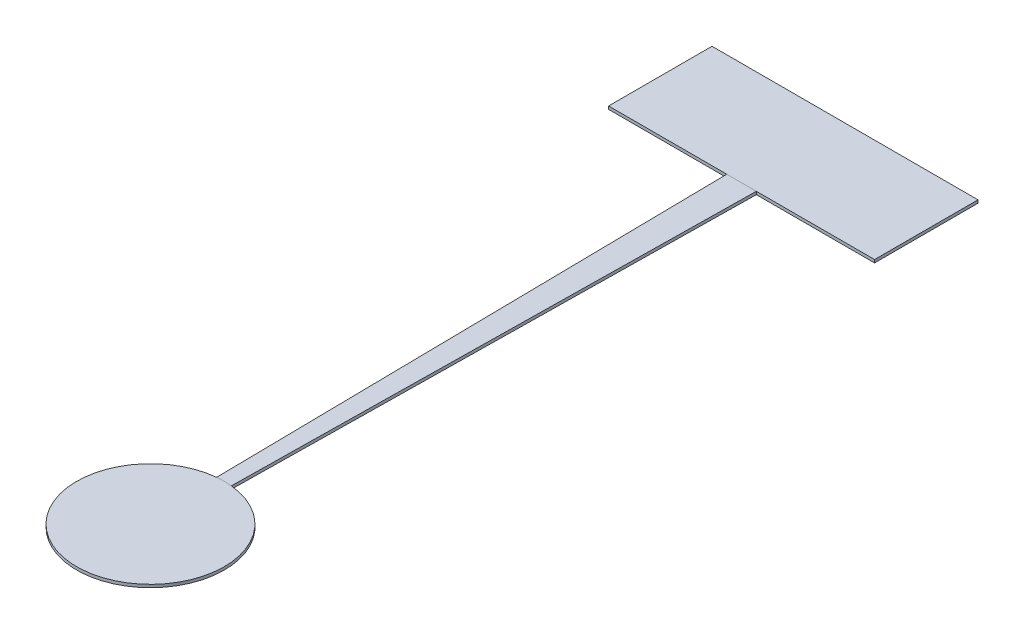
ISO-10303-21;
HEADER;
FILE_DESCRIPTION(('STEP AP214'),'2;1');
FILE_NAME('part.step','',(''),(''),'','','');
FILE_SCHEMA(('AUTOMOTIVE_DESIGN { 1 0 10303 214 1 1 1 1 }'));
ENDSEC;
DATA;
#1=APPLICATION_CONTEXT('core data for automotive mechanical design processes');
#2=APPLICATION_PROTOCOL_DEFINITION('international standard','automotive_design',2000,#1);
#3=PRODUCT_CONTEXT('',#1,'mechanical');
#4=PRODUCT('Part','Part','',(#3));
#5=PRODUCT_RELATED_PRODUCT_CATEGORY('part','',(#4));
#6=PRODUCT_DEFINITION_FORMATION('','',#4);
#7=PRODUCT_DEFINITION_CONTEXT('part definition',#1,'design');
#8=PRODUCT_DEFINITION('design','',#6,#7);
#9=PRODUCT_DEFINITION_SHAPE('','',#8);
#10=(LENGTH_UNIT() NAMED_UNIT(*) SI_UNIT(.MILLI.,.METRE.));
#11=(NAMED_UNIT(*) PLANE_ANGLE_UNIT() SI_UNIT($,.RADIAN.));
#12=(NAMED_UNIT(*) SI_UNIT($,.STERADIAN.) SOLID_ANGLE_UNIT());
#13=UNCERTAINTY_MEASURE_WITH_UNIT(LENGTH_MEASURE(1.E-05),#10,'distance_accuracy_value','');
#14=(GEOMETRIC_REPRESENTATION_CONTEXT(3) GLOBAL_UNCERTAINTY_ASSIGNED_CONTEXT((#13)) GLOBAL_UNIT_ASSIGNED_CONTEXT((#10,
#11,#12)) REPRESENTATION_CONTEXT('',''));
#15=CARTESIAN_POINT('',(0.,0.,0.));
#16=DIRECTION('',(0.,0.,1.));
#17=DIRECTION('',(1.,0.,0.));
#18=AXIS2_PLACEMENT_3D('',#15,#16,#17);
#19=CARTESIAN_POINT('',(0.,0.2,43.5));
#20=DIRECTION('',(0.,1.,0.));
#21=DIRECTION('',(0.,0.,1.));
#22=AXIS2_PLACEMENT_3D('',#19,#20,#21);
#23=PLANE('',#22);
#24=CARTESIAN_POINT('',(0.,0.2,43.5));
#25=DIRECTION('',(0.,1.,0.));
#26=DIRECTION('',(0.,0.,1.));
#27=AXIS2_PLACEMENT_3D('',#24,#25,#26);
#28=CIRCLE('',#27,5.);
#29=CARTESIAN_POINT('',(-0.499999999999995,0.2,38.5250628144669));
#30=VERTEX_POINT('',#29);
#31=CARTESIAN_POINT('',(0.500000000000004,0.2,38.5250628144669));
#32=VERTEX_POINT('',#31);
#33=EDGE_CURVE('E190',#30,#32,#28,.T.);
#34=ORIENTED_EDGE('',*,*,#33,.T.);
#35=CARTESIAN_POINT('',(0.,0.2,43.5));
#36=DIRECTION('',(0.,1.,0.));
#37=DIRECTION('',(0.,0.,1.));
#38=AXIS2_PLACEMENT_3D('',#35,#36,#37);
#39=CIRCLE('',#38,5.);
#40=EDGE_CURVE('E11',#32,#30,#39,.T.);
#41=ORIENTED_EDGE('',*,*,#40,.T.);
#42=EDGE_LOOP('',(#34,#41));
#43=FACE_BOUND('',#42,.T.);
#44=ADVANCED_FACE('F45',(#43),#23,.T.);
#45=ORIENTED_EDGE('',*,*,#40,.F.);
#46=DIRECTION('',(0.0142740375089905,0.,-0.999898120736904));
#47=VECTOR('',#46,1.);
#48=CARTESIAN_POINT('',(1.,0.2,3.5));
#49=LINE('',#48,#47);
#50=CARTESIAN_POINT('',(1.,0.2,3.5));
#51=VERTEX_POINT('',#50);
#52=EDGE_CURVE('E128',#32,#51,#49,.T.);
#53=ORIENTED_EDGE('',*,*,#52,.T.);
#54=DIRECTION('',(-1.,0.,0.));
#55=VECTOR('',#54,1.);
#56=CARTESIAN_POINT('',(0.,0.2,3.5));
#57=LINE('',#56,#55);
#58=CARTESIAN_POINT('',(-1.,0.2,3.5));
#59=VERTEX_POINT('',#58);
#60=EDGE_CURVE('E55',#51,#59,#57,.T.);
#61=ORIENTED_EDGE('',*,*,#60,.T.);
#62=DIRECTION('',(0.0142740375089907,0.,0.999898120736904));
#63=VECTOR('',#62,1.);
#64=CARTESIAN_POINT('',(-1.,0.2,3.5));
#65=LINE('',#64,#63);
#66=EDGE_CURVE('E178',#59,#30,#65,.T.);
#67=ORIENTED_EDGE('',*,*,#66,.T.);
#68=EDGE_LOOP('',(#45,#53,#61,#67));
#69=FACE_BOUND('',#68,.T.);
#70=ADVANCED_FACE('F176',(#69),#23,.T.);
#71=CARTESIAN_POINT('',(-9.,0.2,3.5));
#72=DIRECTION('',(1.,0.,0.));
#73=DIRECTION('',(0.,0.,-1.));
#74=AXIS2_PLACEMENT_3D('',#71,#72,#73);
#75=PLANE('',#74);
#76=DIRECTION('',(0.,0.,1.));
#77=VECTOR('',#76,1.);
#78=CARTESIAN_POINT('',(-9.,0.,3.5));
#79=LINE('',#78,#77);
#80=CARTESIAN_POINT('',(-9.,0.,-3.5));
#81=VERTEX_POINT('',#80);
#82=CARTESIAN_POINT('',(-9.,0.,3.5));
#83=VERTEX_POINT('',#82);
#84=EDGE_CURVE('E143',#81,#83,#79,.T.);
#85=ORIENTED_EDGE('',*,*,#84,.T.);
#86=DIRECTION('',(0.,-1.,0.));
#87=VECTOR('',#86,1.);
#88=CARTESIAN_POINT('',(-9.,0.2,3.5));
#89=LINE('',#88,#87);
#90=CARTESIAN_POINT('',(-9.,0.2,3.5));
#91=VERTEX_POINT('',#90);
#92=EDGE_CURVE('E170',#91,#83,#89,.T.);
#93=ORIENTED_EDGE('',*,*,#92,.F.);
#94=DIRECTION('',(0.,0.,1.));
#95=VECTOR('',#94,1.);
#96=CARTESIAN_POINT('',(-9.,0.2,3.5));
#97=LINE('',#96,#95);
#98=CARTESIAN_POINT('',(-9.,0.2,-3.5));
#99=VERTEX_POINT('',#98);
#100=EDGE_CURVE('E157',#99,#91,#97,.T.);
#101=ORIENTED_EDGE('',*,*,#100,.F.);
#102=DIRECTION('',(0.,-1.,0.));
#103=VECTOR('',#102,1.);
#104=CARTESIAN_POINT('',(-9.,0.2,-3.5));
#105=LINE('',#104,#103);
#106=EDGE_CURVE('E139',#99,#81,#105,.T.);
#107=ORIENTED_EDGE('',*,*,#106,.T.);
#108=EDGE_LOOP('',(#85,#93,#101,#107));
#109=FACE_BOUND('',#108,.T.);
#110=ADVANCED_FACE('F47',(#109),#75,.F.);
#111=CARTESIAN_POINT('',(-1.,0.2,3.5));
#112=DIRECTION('',(0.,0.,-1.));
#113=DIRECTION('',(-1.,0.,0.));
#114=AXIS2_PLACEMENT_3D('',#111,#112,#113);
#115=PLANE('',#114);
#116=DIRECTION('',(1.,0.,0.));
#117=VECTOR('',#116,1.);
#118=CARTESIAN_POINT('',(-1.,0.,3.5));
#119=LINE('',#118,#117);
#120=CARTESIAN_POINT('',(-1.,0.,3.5));
#121=VERTEX_POINT('',#120);
#122=EDGE_CURVE('E146',#83,#121,#119,.T.);
#123=ORIENTED_EDGE('',*,*,#122,.T.);
#124=DIRECTION('',(0.,-1.,0.));
#125=VECTOR('',#124,1.);
#126=CARTESIAN_POINT('',(-1.,0.2,3.5));
#127=LINE('',#126,#125);
#128=EDGE_CURVE('E167',#59,#121,#127,.T.);
#129=ORIENTED_EDGE('',*,*,#128,.F.);
#130=DIRECTION('',(1.,0.,0.));
#131=VECTOR('',#130,1.);
#132=CARTESIAN_POINT('',(-1.,0.2,3.5));
#133=LINE('',#132,#131);
#134=EDGE_CURVE('E107',#91,#59,#133,.T.);
#135=ORIENTED_EDGE('',*,*,#134,.F.);
#136=ORIENTED_EDGE('',*,*,#92,.T.);
#137=EDGE_LOOP('',(#123,#129,#135,#136));
#138=FACE_BOUND('',#137,.T.);
#139=ADVANCED_FACE('F185',(#138),#115,.F.);
#140=CARTESIAN_POINT('',(-1.,0.2,3.5));
#141=DIRECTION('',(0.999898120736904,0.,-0.0142740375089907));
#142=DIRECTION('',(-0.0142740375089907,0.,-0.999898120736904));
#143=AXIS2_PLACEMENT_3D('',#140,#141,#142);
#144=PLANE('',#143);
#145=DIRECTION('',(0.0142740375089907,0.,0.999898120736904));
#146=VECTOR('',#145,1.);
#147=CARTESIAN_POINT('',(-1.,0.,3.5));
#148=LINE('',#147,#146);
#149=CARTESIAN_POINT('',(-0.499999999999995,0.,38.5250628144669));
#150=VERTEX_POINT('',#149);
#151=EDGE_CURVE('E148',#121,#150,#148,.T.);
#152=ORIENTED_EDGE('',*,*,#151,.T.);
#153=DIRECTION('',(0.,-1.,0.));
#154=VECTOR('',#153,1.);
#155=CARTESIAN_POINT('',(-0.499999999999995,0.2,38.5250628144669));
#156=LINE('',#155,#154);
#157=EDGE_CURVE('E164',#30,#150,#156,.T.);
#158=ORIENTED_EDGE('',*,*,#157,.F.);
#159=ORIENTED_EDGE('',*,*,#66,.F.);
#160=ORIENTED_EDGE('',*,*,#128,.T.);
#161=EDGE_LOOP('',(#152,#158,#159,#160));
#162=FACE_BOUND('',#161,.T.);
#163=ADVANCED_FACE('F188',(#162),#144,.F.);
#164=CARTESIAN_POINT('',(0.,0.2,43.5));
#165=DIRECTION('',(0.,-1.,0.));
#166=DIRECTION('',(0.,0.,-1.));
#167=AXIS2_PLACEMENT_3D('',#164,#165,#166);
#168=CYLINDRICAL_SURFACE('',#167,5.);
#169=CARTESIAN_POINT('',(0.,0.,43.5));
#170=DIRECTION('',(0.,1.,0.));
#171=DIRECTION('',(0.,0.,1.));
#172=AXIS2_PLACEMENT_3D('',#169,#170,#171);
#173=CIRCLE('',#172,5.);
#174=CARTESIAN_POINT('',(0.500000000000004,0.,38.5250628144669));
#175=VERTEX_POINT('',#174);
#176=EDGE_CURVE('E150',#150,#175,#173,.T.);
#177=ORIENTED_EDGE('',*,*,#176,.T.);
#178=DIRECTION('',(0.,-1.,0.));
#179=VECTOR('',#178,1.);
#180=CARTESIAN_POINT('',(0.500000000000004,0.2,38.5250628144669));
#181=LINE('',#180,#179);
#182=EDGE_CURVE('E161',#32,#175,#181,.T.);
#183=ORIENTED_EDGE('',*,*,#182,.F.);
#184=ORIENTED_EDGE('',*,*,#33,.F.);
#185=ORIENTED_EDGE('',*,*,#157,.T.);
#186=EDGE_LOOP('',(#177,#183,#184,#185));
#187=FACE_BOUND('',#186,.T.);
#188=ADVANCED_FACE('F198',(#187),#168,.T.);
#189=CARTESIAN_POINT('',(1.,0.2,3.5));
#190=DIRECTION('',(-0.999898120736904,0.,-0.0142740375089905));
#191=DIRECTION('',(-0.0142740375089905,0.,0.999898120736904));
#192=AXIS2_PLACEMENT_3D('',#189,#190,#191);
#193=PLANE('',#192);
#194=DIRECTION('',(0.0142740375089905,0.,-0.999898120736904));
#195=VECTOR('',#194,1.);
#196=CARTESIAN_POINT('',(1.,0.,3.5));
#197=LINE('',#196,#195);
#198=CARTESIAN_POINT('',(1.,0.,3.5));
#199=VERTEX_POINT('',#198);
#200=EDGE_CURVE('E152',#175,#199,#197,.T.);
#201=ORIENTED_EDGE('',*,*,#200,.T.);
#202=DIRECTION('',(0.,-1.,0.));
#203=VECTOR('',#202,1.);
#204=CARTESIAN_POINT('',(1.,0.2,3.5));
#205=LINE('',#204,#203);
#206=EDGE_CURVE('E134',#51,#199,#205,.T.);
#207=ORIENTED_EDGE('',*,*,#206,.F.);
#208=ORIENTED_EDGE('',*,*,#52,.F.);
#209=ORIENTED_EDGE('',*,*,#182,.T.);
#210=EDGE_LOOP('',(#201,#207,#208,#209));
#211=FACE_BOUND('',#210,.T.);
#212=ADVANCED_FACE('F202',(#211),#193,.F.);
#213=CARTESIAN_POINT('',(9.,0.2,3.5));
#214=DIRECTION('',(0.,0.,-1.));
#215=DIRECTION('',(-1.,0.,0.));
#216=AXIS2_PLACEMENT_3D('',#213,#214,#215);
#217=PLANE('',#216);
#218=DIRECTION('',(1.,0.,0.));
#219=VECTOR('',#218,1.);
#220=CARTESIAN_POINT('',(9.,0.,3.5));
#221=LINE('',#220,#219);
#222=CARTESIAN_POINT('',(9.,0.,3.5));
#223=VERTEX_POINT('',#222);
#224=EDGE_CURVE('E133',#199,#223,#221,.T.);
#225=ORIENTED_EDGE('',*,*,#224,.T.);
#226=DIRECTION('',(0.,-1.,0.));
#227=VECTOR('',#226,1.);
#228=CARTESIAN_POINT('',(9.,0.2,3.5));
#229=LINE('',#228,#227);
#230=CARTESIAN_POINT('',(9.,0.2,3.5));
#231=VERTEX_POINT('',#230);
#232=EDGE_CURVE('E130',#231,#223,#229,.T.);
#233=ORIENTED_EDGE('',*,*,#232,.F.);
#234=DIRECTION('',(1.,0.,0.));
#235=VECTOR('',#234,1.);
#236=CARTESIAN_POINT('',(9.,0.2,3.5));
#237=LINE('',#236,#235);
#238=EDGE_CURVE('E120',#51,#231,#237,.T.);
#239=ORIENTED_EDGE('',*,*,#238,.F.);
#240=ORIENTED_EDGE('',*,*,#206,.T.);
#241=EDGE_LOOP('',(#225,#233,#239,#240));
#242=FACE_BOUND('',#241,.T.);
#243=ADVANCED_FACE('F131',(#242),#217,.F.);
#244=CARTESIAN_POINT('',(9.,0.2,3.5));
#245=DIRECTION('',(-1.,0.,0.));
#246=DIRECTION('',(0.,0.,1.));
#247=AXIS2_PLACEMENT_3D('',#244,#245,#246);
#248=PLANE('',#247);
#249=DIRECTION('',(0.,0.,-1.));
#250=VECTOR('',#249,1.);
#251=CARTESIAN_POINT('',(9.,0.,3.5));
#252=LINE('',#251,#250);
#253=CARTESIAN_POINT('',(9.,0.,-3.5));
#254=VERTEX_POINT('',#253);
#255=EDGE_CURVE('E92',#223,#254,#252,.T.);
#256=ORIENTED_EDGE('',*,*,#255,.T.);
#257=DIRECTION('',(0.,-1.,0.));
#258=VECTOR('',#257,1.);
#259=CARTESIAN_POINT('',(9.,0.2,-3.5));
#260=LINE('',#259,#258);
#261=CARTESIAN_POINT('',(9.,0.2,-3.5));
#262=VERTEX_POINT('',#261);
#263=EDGE_CURVE('E135',#262,#254,#260,.T.);
#264=ORIENTED_EDGE('',*,*,#263,.F.);
#265=DIRECTION('',(0.,0.,-1.));
#266=VECTOR('',#265,1.);
#267=CARTESIAN_POINT('',(9.,0.2,3.5));
#268=LINE('',#267,#266);
#269=EDGE_CURVE('E124',#231,#262,#268,.T.);
#270=ORIENTED_EDGE('',*,*,#269,.F.);
#271=ORIENTED_EDGE('',*,*,#232,.T.);
#272=EDGE_LOOP('',(#256,#264,#270,#271));
#273=FACE_BOUND('',#272,.T.);
#274=ADVANCED_FACE('F137',(#273),#248,.F.);
#275=CARTESIAN_POINT('',(9.,0.2,-3.5));
#276=DIRECTION('',(0.,0.,1.));
#277=DIRECTION('',(1.,0.,0.));
#278=AXIS2_PLACEMENT_3D('',#275,#276,#277);
#279=PLANE('',#278);
#280=DIRECTION('',(-1.,0.,0.));
#281=VECTOR('',#280,1.);
#282=CARTESIAN_POINT('',(9.,0.,-3.5));
#283=LINE('',#282,#281);
#284=EDGE_CURVE('E98',#254,#81,#283,.T.);
#285=ORIENTED_EDGE('',*,*,#284,.T.);
#286=ORIENTED_EDGE('',*,*,#106,.F.);
#287=DIRECTION('',(-1.,0.,0.));
#288=VECTOR('',#287,1.);
#289=CARTESIAN_POINT('',(9.,0.2,-3.5));
#290=LINE('',#289,#288);
#291=EDGE_CURVE('E63',#262,#99,#290,.T.);
#292=ORIENTED_EDGE('',*,*,#291,.F.);
#293=ORIENTED_EDGE('',*,*,#263,.T.);
#294=EDGE_LOOP('',(#285,#286,#292,#293));
#295=FACE_BOUND('',#294,.T.);
#296=ADVANCED_FACE('F207',(#295),#279,.F.);
#297=ORIENTED_EDGE('',*,*,#60,.F.);
#298=ORIENTED_EDGE('',*,*,#238,.T.);
#299=ORIENTED_EDGE('',*,*,#269,.T.);
#300=ORIENTED_EDGE('',*,*,#291,.T.);
#301=ORIENTED_EDGE('',*,*,#100,.T.);
#302=ORIENTED_EDGE('',*,*,#134,.T.);
#303=EDGE_LOOP('',(#297,#298,#299,#300,#301,#302));
#304=FACE_BOUND('',#303,.T.);
#305=ADVANCED_FACE('F122',(#304),#23,.T.);
#306=CARTESIAN_POINT('',(0.,0.,43.5));
#307=DIRECTION('',(0.,1.,0.));
#308=DIRECTION('',(0.,0.,1.));
#309=AXIS2_PLACEMENT_3D('',#306,#307,#308);
#310=PLANE('',#309);
#311=ORIENTED_EDGE('',*,*,#84,.F.);
#312=ORIENTED_EDGE('',*,*,#284,.F.);
#313=ORIENTED_EDGE('',*,*,#255,.F.);
#314=ORIENTED_EDGE('',*,*,#224,.F.);
#315=ORIENTED_EDGE('',*,*,#200,.F.);
#316=ORIENTED_EDGE('',*,*,#176,.F.);
#317=ORIENTED_EDGE('',*,*,#151,.F.);
#318=ORIENTED_EDGE('',*,*,#122,.F.);
#319=EDGE_LOOP('',(#311,#312,#313,#314,#315,#316,#317,#318));
#320=FACE_BOUND('',#319,.T.);
#321=ADVANCED_FACE('F205',(#320),#310,.F.);
#322=CLOSED_SHELL('',(#44,#70,#110,#139,#163,#188,#212,#243,#274,#296,#305,#321));
#323=MANIFOLD_SOLID_BREP('B2',#322);
#324=ADVANCED_BREP_SHAPE_REPRESENTATION('',(#18,#323),#14);
#325=SHAPE_DEFINITION_REPRESENTATION(#9,#324);
ENDSEC;
END-ISO-10303-21;
